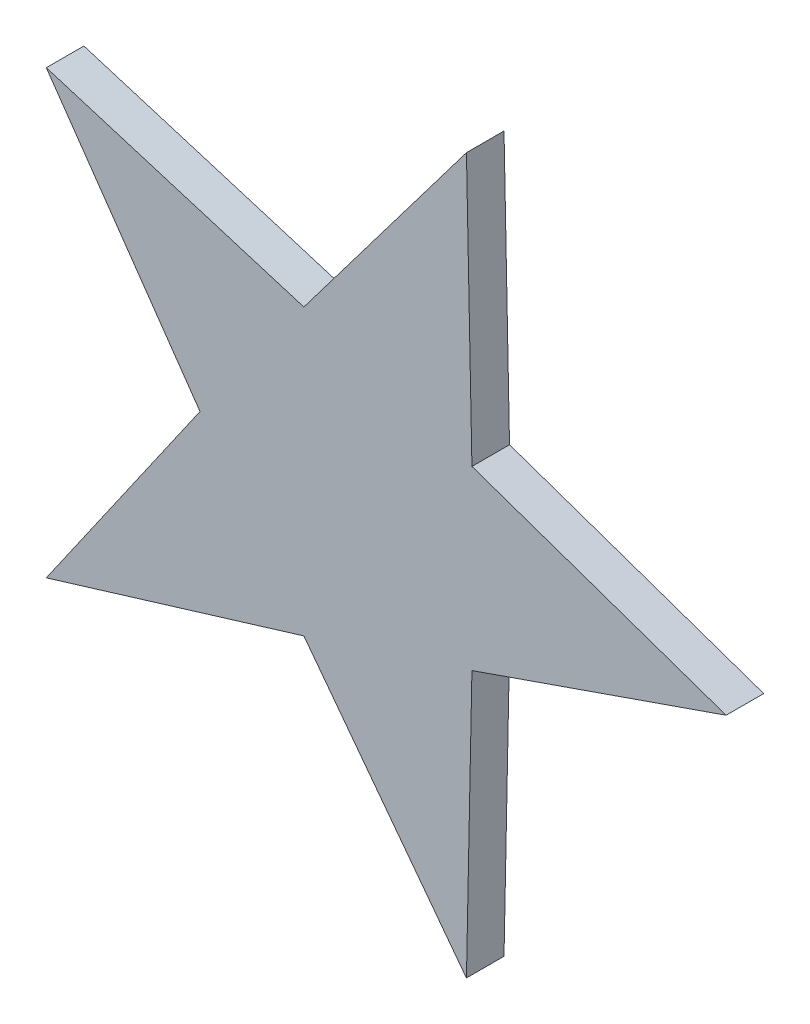
ISO-10303-21;
HEADER;
FILE_DESCRIPTION(('STEP AP214'),'2;1');
FILE_NAME('part.step','',(''),(''),'','','');
FILE_SCHEMA(('AUTOMOTIVE_DESIGN { 1 0 10303 214 1 1 1 1 }'));
ENDSEC;
DATA;
#1=APPLICATION_CONTEXT('core data for automotive mechanical design processes');
#2=APPLICATION_PROTOCOL_DEFINITION('international standard','automotive_design',2000,#1);
#3=PRODUCT_CONTEXT('',#1,'mechanical');
#4=PRODUCT('Part','Part','',(#3));
#5=PRODUCT_RELATED_PRODUCT_CATEGORY('part','',(#4));
#6=PRODUCT_DEFINITION_FORMATION('','',#4);
#7=PRODUCT_DEFINITION_CONTEXT('part definition',#1,'design');
#8=PRODUCT_DEFINITION('design','',#6,#7);
#9=PRODUCT_DEFINITION_SHAPE('','',#8);
#10=(LENGTH_UNIT() NAMED_UNIT(*) SI_UNIT(.MILLI.,.METRE.));
#11=(NAMED_UNIT(*) PLANE_ANGLE_UNIT() SI_UNIT($,.RADIAN.));
#12=(NAMED_UNIT(*) SI_UNIT($,.STERADIAN.) SOLID_ANGLE_UNIT());
#13=UNCERTAINTY_MEASURE_WITH_UNIT(LENGTH_MEASURE(1.E-05),#10,'distance_accuracy_value','');
#14=(GEOMETRIC_REPRESENTATION_CONTEXT(3) GLOBAL_UNCERTAINTY_ASSIGNED_CONTEXT((#13)) GLOBAL_UNIT_ASSIGNED_CONTEXT((#10,
#11,#12)) REPRESENTATION_CONTEXT('',''));
#15=CARTESIAN_POINT('',(0.,0.,0.));
#16=DIRECTION('',(0.,0.,1.));
#17=DIRECTION('',(1.,0.,0.));
#18=AXIS2_PLACEMENT_3D('',#15,#16,#17);
#19=CARTESIAN_POINT('',(161.8,-117.6,50.));
#20=DIRECTION('',(-0.328433966513994,0.944526934311502,0.));
#21=DIRECTION('',(-0.944526934311502,-0.328433966513994,0.));
#22=AXIS2_PLACEMENT_3D('',#19,#20,#21);
#23=PLANE('',#22);
#24=DIRECTION('',(0.944526934311502,0.328433966513994,0.));
#25=VECTOR('',#24,1.);
#26=CARTESIAN_POINT('',(161.8,-117.6,0.));
#27=LINE('',#26,#25);
#28=CARTESIAN_POINT('',(161.8,-117.6,0.));
#29=VERTEX_POINT('',#28);
#30=CARTESIAN_POINT('',(500.,0.,0.));
#31=VERTEX_POINT('',#30);
#32=EDGE_CURVE('E149',#29,#31,#27,.T.);
#33=ORIENTED_EDGE('',*,*,#32,.T.);
#34=DIRECTION('',(0.,0.,-1.));
#35=VECTOR('',#34,1.);
#36=CARTESIAN_POINT('',(500.,0.,50.));
#37=LINE('',#36,#35);
#38=CARTESIAN_POINT('',(500.,0.,50.));
#39=VERTEX_POINT('',#38);
#40=EDGE_CURVE('E11',#39,#31,#37,.T.);
#41=ORIENTED_EDGE('',*,*,#40,.F.);
#42=DIRECTION('',(0.944526934311502,0.328433966513994,0.));
#43=VECTOR('',#42,1.);
#44=CARTESIAN_POINT('',(161.8,-117.6,50.));
#45=LINE('',#44,#43);
#46=CARTESIAN_POINT('',(161.8,-117.6,50.));
#47=VERTEX_POINT('',#46);
#48=EDGE_CURVE('E167',#47,#39,#45,.T.);
#49=ORIENTED_EDGE('',*,*,#48,.F.);
#50=DIRECTION('',(0.,0.,-1.));
#51=VECTOR('',#50,1.);
#52=CARTESIAN_POINT('',(161.8,-117.6,50.));
#53=LINE('',#52,#51);
#54=EDGE_CURVE('E145',#47,#29,#53,.T.);
#55=ORIENTED_EDGE('',*,*,#54,.T.);
#56=EDGE_LOOP('',(#33,#41,#49,#55));
#57=FACE_BOUND('',#56,.T.);
#58=ADVANCED_FACE('F41',(#57),#23,.F.);
#59=CARTESIAN_POINT('',(500.,0.,50.));
#60=DIRECTION('',(-0.328433966513994,-0.944526934311502,0.));
#61=DIRECTION('',(0.944526934311502,-0.328433966513994,0.));
#62=AXIS2_PLACEMENT_3D('',#59,#60,#61);
#63=PLANE('',#62);
#64=DIRECTION('',(-0.944526934311502,0.328433966513994,0.));
#65=VECTOR('',#64,1.);
#66=CARTESIAN_POINT('',(500.,0.,0.));
#67=LINE('',#66,#65);
#68=CARTESIAN_POINT('',(161.8,117.6,0.));
#69=VERTEX_POINT('',#68);
#70=EDGE_CURVE('E152',#31,#69,#67,.T.);
#71=ORIENTED_EDGE('',*,*,#70,.T.);
#72=DIRECTION('',(0.,0.,-1.));
#73=VECTOR('',#72,1.);
#74=CARTESIAN_POINT('',(161.8,117.6,50.));
#75=LINE('',#74,#73);
#76=CARTESIAN_POINT('',(161.8,117.6,50.));
#77=VERTEX_POINT('',#76);
#78=EDGE_CURVE('E49',#77,#69,#75,.T.);
#79=ORIENTED_EDGE('',*,*,#78,.F.);
#80=DIRECTION('',(-0.944526934311502,0.328433966513994,0.));
#81=VECTOR('',#80,1.);
#82=CARTESIAN_POINT('',(500.,0.,50.));
#83=LINE('',#82,#81);
#84=EDGE_CURVE('E106',#39,#77,#83,.T.);
#85=ORIENTED_EDGE('',*,*,#84,.F.);
#86=ORIENTED_EDGE('',*,*,#40,.T.);
#87=EDGE_LOOP('',(#71,#79,#85,#86));
#88=FACE_BOUND('',#87,.T.);
#89=ADVANCED_FACE('F216',(#88),#63,.F.);
#90=CARTESIAN_POINT('',(161.8,117.6,50.));
#91=DIRECTION('',(-0.999792050995947,-0.0203925173854999,0.));
#92=DIRECTION('',(0.0203925173854999,-0.999792050995947,0.));
#93=AXIS2_PLACEMENT_3D('',#90,#91,#92);
#94=PLANE('',#93);
#95=DIRECTION('',(-0.0203925173854999,0.999792050995947,0.));
#96=VECTOR('',#95,1.);
#97=CARTESIAN_POINT('',(161.8,117.6,0.));
#98=LINE('',#97,#96);
#99=CARTESIAN_POINT('',(154.5,475.5,0.));
#100=VERTEX_POINT('',#99);
#101=EDGE_CURVE('E154',#69,#100,#98,.T.);
#102=ORIENTED_EDGE('',*,*,#101,.T.);
#103=DIRECTION('',(0.,0.,-1.));
#104=VECTOR('',#103,1.);
#105=CARTESIAN_POINT('',(154.5,475.5,50.));
#106=LINE('',#105,#104);
#107=CARTESIAN_POINT('',(154.5,475.5,50.));
#108=VERTEX_POINT('',#107);
#109=EDGE_CURVE('E180',#108,#100,#106,.T.);
#110=ORIENTED_EDGE('',*,*,#109,.F.);
#111=DIRECTION('',(-0.0203925173854999,0.999792050995947,0.));
#112=VECTOR('',#111,1.);
#113=CARTESIAN_POINT('',(161.8,117.6,50.));
#114=LINE('',#113,#112);
#115=EDGE_CURVE('E188',#77,#108,#114,.T.);
#116=ORIENTED_EDGE('',*,*,#115,.F.);
#117=ORIENTED_EDGE('',*,*,#78,.T.);
#118=EDGE_LOOP('',(#102,#110,#116,#117));
#119=FACE_BOUND('',#118,.T.);
#120=ADVANCED_FACE('F186',(#119),#94,.F.);
#121=CARTESIAN_POINT('',(154.5,475.5,50.));
#122=DIRECTION('',(0.797584064562319,-0.603207808268635,0.));
#123=DIRECTION('',(0.603207808268635,0.797584064562319,0.));
#124=AXIS2_PLACEMENT_3D('',#121,#122,#123);
#125=PLANE('',#124);
#126=DIRECTION('',(-0.603207808268635,-0.797584064562319,0.));
#127=VECTOR('',#126,1.);
#128=CARTESIAN_POINT('',(154.5,475.5,0.));
#129=LINE('',#128,#127);
#130=CARTESIAN_POINT('',(-61.8,189.5,0.));
#131=VERTEX_POINT('',#130);
#132=EDGE_CURVE('E156',#100,#131,#129,.T.);
#133=ORIENTED_EDGE('',*,*,#132,.T.);
#134=DIRECTION('',(0.,0.,-1.));
#135=VECTOR('',#134,1.);
#136=CARTESIAN_POINT('',(-61.8,189.5,50.));
#137=LINE('',#136,#135);
#138=CARTESIAN_POINT('',(-61.8,189.5,50.));
#139=VERTEX_POINT('',#138);
#140=EDGE_CURVE('E177',#139,#131,#137,.T.);
#141=ORIENTED_EDGE('',*,*,#140,.F.);
#142=DIRECTION('',(-0.603207808268635,-0.797584064562319,0.));
#143=VECTOR('',#142,1.);
#144=CARTESIAN_POINT('',(154.5,475.5,50.));
#145=LINE('',#144,#143);
#146=EDGE_CURVE('E206',#108,#139,#145,.T.);
#147=ORIENTED_EDGE('',*,*,#146,.F.);
#148=ORIENTED_EDGE('',*,*,#109,.T.);
#149=EDGE_LOOP('',(#133,#141,#147,#148));
#150=FACE_BOUND('',#149,.T.);
#151=ADVANCED_FACE('F197',(#150),#125,.F.);
#152=CARTESIAN_POINT('',(-61.8,189.5,50.));
#153=DIRECTION('',(-0.291417076827354,-0.956596094144964,0.));
#154=DIRECTION('',(0.956596094144964,-0.291417076827354,0.));
#155=AXIS2_PLACEMENT_3D('',#152,#153,#154);
#156=PLANE('',#155);
#157=DIRECTION('',(-0.956596094144964,0.291417076827354,0.));
#158=VECTOR('',#157,1.);
#159=CARTESIAN_POINT('',(-61.8,189.5,0.));
#160=LINE('',#159,#158);
#161=CARTESIAN_POINT('',(-404.5,293.9,0.));
#162=VERTEX_POINT('',#161);
#163=EDGE_CURVE('E158',#131,#162,#160,.T.);
#164=ORIENTED_EDGE('',*,*,#163,.T.);
#165=DIRECTION('',(0.,0.,-1.));
#166=VECTOR('',#165,1.);
#167=CARTESIAN_POINT('',(-404.5,293.9,50.));
#168=LINE('',#167,#166);
#169=CARTESIAN_POINT('',(-404.5,293.9,50.));
#170=VERTEX_POINT('',#169);
#171=EDGE_CURVE('E174',#170,#162,#168,.T.);
#172=ORIENTED_EDGE('',*,*,#171,.F.);
#173=DIRECTION('',(-0.956596094144964,0.291417076827354,0.));
#174=VECTOR('',#173,1.);
#175=CARTESIAN_POINT('',(-61.8,189.5,50.));
#176=LINE('',#175,#174);
#177=EDGE_CURVE('E203',#139,#170,#176,.T.);
#178=ORIENTED_EDGE('',*,*,#177,.F.);
#179=ORIENTED_EDGE('',*,*,#140,.T.);
#180=EDGE_LOOP('',(#164,#172,#178,#179));
#181=FACE_BOUND('',#180,.T.);
#182=ADVANCED_FACE('F201',(#181),#156,.F.);
#183=CARTESIAN_POINT('',(-404.5,293.9,50.));
#184=DIRECTION('',(0.820842578257963,0.571154498992016,0.));
#185=DIRECTION('',(-0.571154498992016,0.820842578257963,0.));
#186=AXIS2_PLACEMENT_3D('',#183,#184,#185);
#187=PLANE('',#186);
#188=DIRECTION('',(0.571154498992016,-0.820842578257963,0.));
#189=VECTOR('',#188,1.);
#190=CARTESIAN_POINT('',(-404.5,293.9,0.));
#191=LINE('',#190,#189);
#192=CARTESIAN_POINT('',(-200.,0.,0.));
#193=VERTEX_POINT('',#192);
#194=EDGE_CURVE('E160',#162,#193,#191,.T.);
#195=ORIENTED_EDGE('',*,*,#194,.T.);
#196=DIRECTION('',(0.,0.,-1.));
#197=VECTOR('',#196,1.);
#198=CARTESIAN_POINT('',(-200.,0.,50.));
#199=LINE('',#198,#197);
#200=CARTESIAN_POINT('',(-200.,0.,50.));
#201=VERTEX_POINT('',#200);
#202=EDGE_CURVE('E171',#201,#193,#199,.T.);
#203=ORIENTED_EDGE('',*,*,#202,.F.);
#204=DIRECTION('',(0.571154498992016,-0.820842578257963,0.));
#205=VECTOR('',#204,1.);
#206=CARTESIAN_POINT('',(-404.5,293.9,50.));
#207=LINE('',#206,#205);
#208=EDGE_CURVE('E205',#170,#201,#207,.T.);
#209=ORIENTED_EDGE('',*,*,#208,.F.);
#210=ORIENTED_EDGE('',*,*,#171,.T.);
#211=EDGE_LOOP('',(#195,#203,#209,#210));
#212=FACE_BOUND('',#211,.T.);
#213=ADVANCED_FACE('F228',(#212),#187,.F.);
#214=CARTESIAN_POINT('',(-200.,0.,50.));
#215=DIRECTION('',(0.820842578257963,-0.571154498992016,0.));
#216=DIRECTION('',(0.571154498992016,0.820842578257963,0.));
#217=AXIS2_PLACEMENT_3D('',#214,#215,#216);
#218=PLANE('',#217);
#219=DIRECTION('',(-0.571154498992016,-0.820842578257963,0.));
#220=VECTOR('',#219,1.);
#221=CARTESIAN_POINT('',(-200.,0.,0.));
#222=LINE('',#221,#220);
#223=CARTESIAN_POINT('',(-404.5,-293.9,0.));
#224=VERTEX_POINT('',#223);
#225=EDGE_CURVE('E162',#193,#224,#222,.T.);
#226=ORIENTED_EDGE('',*,*,#225,.T.);
#227=DIRECTION('',(0.,0.,-1.));
#228=VECTOR('',#227,1.);
#229=CARTESIAN_POINT('',(-404.5,-293.9,50.));
#230=LINE('',#229,#228);
#231=CARTESIAN_POINT('',(-404.5,-293.9,50.));
#232=VERTEX_POINT('',#231);
#233=EDGE_CURVE('E140',#232,#224,#230,.T.);
#234=ORIENTED_EDGE('',*,*,#233,.F.);
#235=DIRECTION('',(-0.571154498992016,-0.820842578257963,0.));
#236=VECTOR('',#235,1.);
#237=CARTESIAN_POINT('',(-200.,0.,50.));
#238=LINE('',#237,#236);
#239=EDGE_CURVE('E131',#201,#232,#238,.T.);
#240=ORIENTED_EDGE('',*,*,#239,.F.);
#241=ORIENTED_EDGE('',*,*,#202,.T.);
#242=EDGE_LOOP('',(#226,#234,#240,#241));
#243=FACE_BOUND('',#242,.T.);
#244=ADVANCED_FACE('F231',(#243),#218,.F.);
#245=CARTESIAN_POINT('',(-404.5,-293.9,50.));
#246=DIRECTION('',(-0.291417076827354,0.956596094144964,0.));
#247=DIRECTION('',(-0.956596094144964,-0.291417076827354,0.));
#248=AXIS2_PLACEMENT_3D('',#245,#246,#247);
#249=PLANE('',#248);
#250=DIRECTION('',(0.956596094144964,0.291417076827354,0.));
#251=VECTOR('',#250,1.);
#252=CARTESIAN_POINT('',(-404.5,-293.9,0.));
#253=LINE('',#252,#251);
#254=CARTESIAN_POINT('',(-61.8,-189.5,0.));
#255=VERTEX_POINT('',#254);
#256=EDGE_CURVE('E139',#224,#255,#253,.T.);
#257=ORIENTED_EDGE('',*,*,#256,.T.);
#258=DIRECTION('',(0.,0.,-1.));
#259=VECTOR('',#258,1.);
#260=CARTESIAN_POINT('',(-61.8,-189.5,50.));
#261=LINE('',#260,#259);
#262=CARTESIAN_POINT('',(-61.8,-189.5,50.));
#263=VERTEX_POINT('',#262);
#264=EDGE_CURVE('E136',#263,#255,#261,.T.);
#265=ORIENTED_EDGE('',*,*,#264,.F.);
#266=DIRECTION('',(0.956596094144964,0.291417076827354,0.));
#267=VECTOR('',#266,1.);
#268=CARTESIAN_POINT('',(-404.5,-293.9,50.));
#269=LINE('',#268,#267);
#270=EDGE_CURVE('E125',#232,#263,#269,.T.);
#271=ORIENTED_EDGE('',*,*,#270,.F.);
#272=ORIENTED_EDGE('',*,*,#233,.T.);
#273=EDGE_LOOP('',(#257,#265,#271,#272));
#274=FACE_BOUND('',#273,.T.);
#275=ADVANCED_FACE('F137',(#274),#249,.F.);
#276=CARTESIAN_POINT('',(-61.8,-189.5,50.));
#277=DIRECTION('',(0.797584064562319,0.603207808268635,0.));
#278=DIRECTION('',(-0.603207808268635,0.797584064562319,0.));
#279=AXIS2_PLACEMENT_3D('',#276,#277,#278);
#280=PLANE('',#279);
#281=DIRECTION('',(0.603207808268635,-0.797584064562319,0.));
#282=VECTOR('',#281,1.);
#283=CARTESIAN_POINT('',(-61.8,-189.5,0.));
#284=LINE('',#283,#282);
#285=CARTESIAN_POINT('',(154.5,-475.5,0.));
#286=VERTEX_POINT('',#285);
#287=EDGE_CURVE('E92',#255,#286,#284,.T.);
#288=ORIENTED_EDGE('',*,*,#287,.T.);
#289=DIRECTION('',(0.,0.,-1.));
#290=VECTOR('',#289,1.);
#291=CARTESIAN_POINT('',(154.5,-475.5,50.));
#292=LINE('',#291,#290);
#293=CARTESIAN_POINT('',(154.5,-475.5,50.));
#294=VERTEX_POINT('',#293);
#295=EDGE_CURVE('E141',#294,#286,#292,.T.);
#296=ORIENTED_EDGE('',*,*,#295,.F.);
#297=DIRECTION('',(0.603207808268635,-0.797584064562319,0.));
#298=VECTOR('',#297,1.);
#299=CARTESIAN_POINT('',(-61.8,-189.5,50.));
#300=LINE('',#299,#298);
#301=EDGE_CURVE('E129',#263,#294,#300,.T.);
#302=ORIENTED_EDGE('',*,*,#301,.F.);
#303=ORIENTED_EDGE('',*,*,#264,.T.);
#304=EDGE_LOOP('',(#288,#296,#302,#303));
#305=FACE_BOUND('',#304,.T.);
#306=ADVANCED_FACE('F143',(#305),#280,.F.);
#307=CARTESIAN_POINT('',(154.5,-475.5,50.));
#308=DIRECTION('',(-0.999792050995947,0.0203925173854999,0.));
#309=DIRECTION('',(-0.0203925173854999,-0.999792050995947,0.));
#310=AXIS2_PLACEMENT_3D('',#307,#308,#309);
#311=PLANE('',#310);
#312=DIRECTION('',(0.0203925173854999,0.999792050995947,0.));
#313=VECTOR('',#312,1.);
#314=CARTESIAN_POINT('',(154.5,-475.5,0.));
#315=LINE('',#314,#313);
#316=EDGE_CURVE('E98',#286,#29,#315,.T.);
#317=ORIENTED_EDGE('',*,*,#316,.T.);
#318=ORIENTED_EDGE('',*,*,#54,.F.);
#319=DIRECTION('',(0.0203925173854999,0.999792050995947,0.));
#320=VECTOR('',#319,1.);
#321=CARTESIAN_POINT('',(154.5,-475.5,50.));
#322=LINE('',#321,#320);
#323=EDGE_CURVE('E57',#294,#47,#322,.T.);
#324=ORIENTED_EDGE('',*,*,#323,.F.);
#325=ORIENTED_EDGE('',*,*,#295,.T.);
#326=EDGE_LOOP('',(#317,#318,#324,#325));
#327=FACE_BOUND('',#326,.T.);
#328=ADVANCED_FACE('F240',(#327),#311,.F.);
#329=CARTESIAN_POINT('',(0.,0.,50.));
#330=DIRECTION('',(0.,0.,-1.));
#331=DIRECTION('',(-1.,0.,0.));
#332=AXIS2_PLACEMENT_3D('',#329,#330,#331);
#333=PLANE('',#332);
#334=ORIENTED_EDGE('',*,*,#48,.T.);
#335=ORIENTED_EDGE('',*,*,#84,.T.);
#336=ORIENTED_EDGE('',*,*,#115,.T.);
#337=ORIENTED_EDGE('',*,*,#146,.T.);
#338=ORIENTED_EDGE('',*,*,#177,.T.);
#339=ORIENTED_EDGE('',*,*,#208,.T.);
#340=ORIENTED_EDGE('',*,*,#239,.T.);
#341=ORIENTED_EDGE('',*,*,#270,.T.);
#342=ORIENTED_EDGE('',*,*,#301,.T.);
#343=ORIENTED_EDGE('',*,*,#323,.T.);
#344=EDGE_LOOP('',(#334,#335,#336,#337,#338,#339,#340,#341,#342,#343));
#345=FACE_BOUND('',#344,.T.);
#346=ADVANCED_FACE('F127',(#345),#333,.F.);
#347=CARTESIAN_POINT('',(0.,0.,0.));
#348=DIRECTION('',(0.,0.,-1.));
#349=DIRECTION('',(-1.,0.,0.));
#350=AXIS2_PLACEMENT_3D('',#347,#348,#349);
#351=PLANE('',#350);
#352=ORIENTED_EDGE('',*,*,#32,.F.);
#353=ORIENTED_EDGE('',*,*,#316,.F.);
#354=ORIENTED_EDGE('',*,*,#287,.F.);
#355=ORIENTED_EDGE('',*,*,#256,.F.);
#356=ORIENTED_EDGE('',*,*,#225,.F.);
#357=ORIENTED_EDGE('',*,*,#194,.F.);
#358=ORIENTED_EDGE('',*,*,#163,.F.);
#359=ORIENTED_EDGE('',*,*,#132,.F.);
#360=ORIENTED_EDGE('',*,*,#101,.F.);
#361=ORIENTED_EDGE('',*,*,#70,.F.);
#362=EDGE_LOOP('',(#352,#353,#354,#355,#356,#357,#358,#359,#360,#361));
#363=FACE_BOUND('',#362,.T.);
#364=ADVANCED_FACE('F192',(#363),#351,.T.);
#365=CLOSED_SHELL('',(#58,#89,#120,#151,#182,#213,#244,#275,#306,#328,#346,#364));
#366=MANIFOLD_SOLID_BREP('B2',#365);
#367=ADVANCED_BREP_SHAPE_REPRESENTATION('',(#18,#366),#14);
#368=SHAPE_DEFINITION_REPRESENTATION(#9,#367);
ENDSEC;
END-ISO-10303-21;
